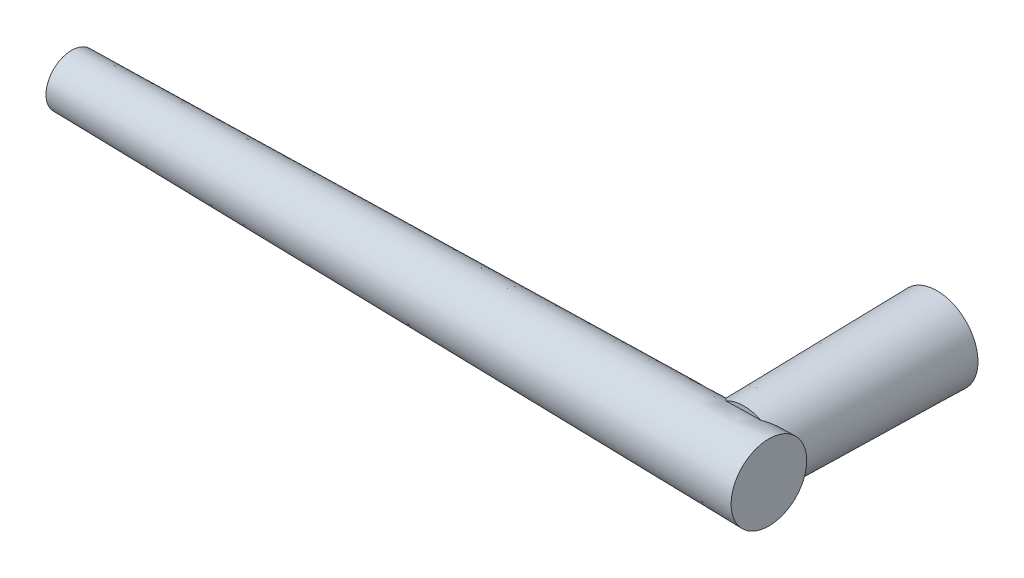
ISO-10303-21;
HEADER;
FILE_DESCRIPTION(('STEP AP214'),'2;1');
FILE_NAME('part.step','',(''),(''),'','','');
FILE_SCHEMA(('AUTOMOTIVE_DESIGN { 1 0 10303 214 1 1 1 1 }'));
ENDSEC;
DATA;
#1=APPLICATION_CONTEXT('core data for automotive mechanical design processes');
#2=APPLICATION_PROTOCOL_DEFINITION('international standard','automotive_design',2000,#1);
#3=PRODUCT_CONTEXT('',#1,'mechanical');
#4=PRODUCT('Part','Part','',(#3));
#5=PRODUCT_RELATED_PRODUCT_CATEGORY('part','',(#4));
#6=PRODUCT_DEFINITION_FORMATION('','',#4);
#7=PRODUCT_DEFINITION_CONTEXT('part definition',#1,'design');
#8=PRODUCT_DEFINITION('design','',#6,#7);
#9=PRODUCT_DEFINITION_SHAPE('','',#8);
#10=(LENGTH_UNIT() NAMED_UNIT(*) SI_UNIT(.MILLI.,.METRE.));
#11=(NAMED_UNIT(*) PLANE_ANGLE_UNIT() SI_UNIT($,.RADIAN.));
#12=(NAMED_UNIT(*) SI_UNIT($,.STERADIAN.) SOLID_ANGLE_UNIT());
#13=UNCERTAINTY_MEASURE_WITH_UNIT(LENGTH_MEASURE(1.E-05),#10,'distance_accuracy_value','');
#14=(GEOMETRIC_REPRESENTATION_CONTEXT(3) GLOBAL_UNCERTAINTY_ASSIGNED_CONTEXT((#13)) GLOBAL_UNIT_ASSIGNED_CONTEXT((#10,
#11,#12)) REPRESENTATION_CONTEXT('',''));
#15=CARTESIAN_POINT('',(0.,0.,0.));
#16=DIRECTION('',(0.,0.,1.));
#17=DIRECTION('',(1.,0.,0.));
#18=AXIS2_PLACEMENT_3D('',#15,#16,#17);
#19=CARTESIAN_POINT('',(0.,0.,24.));
#20=DIRECTION('',(0.,0.,1.));
#21=DIRECTION('',(1.,0.,0.));
#22=AXIS2_PLACEMENT_3D('',#19,#20,#21);
#23=PLANE('',#22);
#24=CARTESIAN_POINT('',(2.07741436600784,4.19485934561172,24.));
#25=CARTESIAN_POINT('',(1.35812225715702,4.18095033297915,24.));
#26=CARTESIAN_POINT('',(0.638830404039702,4.1670281203818,24.));
#27=CARTESIAN_POINT('',(-0.799752790731902,4.1391572952575,24.));
#28=CARTESIAN_POINT('',(-1.51904413238619,4.12520868273054,24.));
#29=CARTESIAN_POINT('',(-2.23833521830698,4.11124687023881,24.));
#30=B_SPLINE_CURVE_WITH_KNOTS('',3,(#24,#25,#26,#27,#28,#29),.UNSPECIFIED.,.F.,.F.,(4,2,4),(0.,
2.15827972739424,4.31655945480037),.UNSPECIFIED.);
#31=CARTESIAN_POINT('',(2.07741436600784,4.19485934561172,24.));
#32=VERTEX_POINT('',#31);
#33=CARTESIAN_POINT('',(-2.23833521830698,4.11124687023881,24.));
#34=VERTEX_POINT('',#33);
#35=EDGE_CURVE('E11',#32,#34,#30,.T.);
#36=ORIENTED_EDGE('',*,*,#35,.F.);
#37=CARTESIAN_POINT('',(0.,0.,24.));
#38=DIRECTION('',(0.,0.,1.));
#39=DIRECTION('',(1.,0.,0.));
#40=AXIS2_PLACEMENT_3D('',#37,#38,#39);
#41=CIRCLE('',#40,4.68107844172278);
#42=EDGE_CURVE('E71',#32,#34,#41,.T.);
#43=ORIENTED_EDGE('',*,*,#42,.T.);
#44=EDGE_LOOP('',(#36,#43));
#45=FACE_BOUND('',#44,.T.);
#46=ADVANCED_FACE('F44',(#45),#23,.T.);
#47=CARTESIAN_POINT('',(0.,0.,0.));
#48=DIRECTION('',(0.,0.,-1.));
#49=DIRECTION('',(1.,0.,0.));
#50=AXIS2_PLACEMENT_3D('',#47,#48,#49);
#51=CONICAL_SURFACE('',#50,5.1,0.0174532925199433);
#52=ORIENTED_EDGE('',*,*,#42,.F.);
#53=CARTESIAN_POINT('',(4.62946610201317,0.952113458118666,21.4058359474263));
#54=CARTESIAN_POINT('',(4.6678080599891,0.76897668688883,21.3672094470046));
#55=CARTESIAN_POINT('',(4.69552302533279,0.581192135724765,21.3392953739237));
#56=CARTESIAN_POINT('',(4.72762774543236,0.201578669276947,21.3069606365025));
#57=CARTESIAN_POINT('',(4.73201059822167,0.0097485741103849,21.302546923899));
#58=CARTESIAN_POINT('',(4.71711347778657,-0.371950091179068,21.3175501982362));
#59=CARTESIAN_POINT('',(4.69784389073633,-0.561819485368872,21.3369567253191));
#60=CARTESIAN_POINT('',(4.6370963629312,-0.934196859812772,21.3981477407934));
#61=CARTESIAN_POINT('',(4.59561230193108,-1.11670279647413,21.4399383961719));
#62=CARTESIAN_POINT('',(4.4930769533045,-1.47038792563278,21.5432630818858));
#63=CARTESIAN_POINT('',(4.43200138043407,-1.64155274049743,21.6048216161898));
#64=CARTESIAN_POINT('',(4.2935070488294,-1.96982975729361,21.7444722392737));
#65=CARTESIAN_POINT('',(4.21608226570798,-2.12693674870614,21.8225704226451));
#66=CARTESIAN_POINT('',(4.00470217024436,-2.50288652151101,22.0359160929234));
#67=CARTESIAN_POINT('',(3.86214693378467,-2.71194818847277,22.1799036396716));
#68=CARTESIAN_POINT('',(3.55540680863572,-3.09508103834212,22.490178389073));
#69=CARTESIAN_POINT('',(3.3911631238375,-3.26905373550321,22.6565262319859));
#70=CARTESIAN_POINT('',(3.10086225980611,-3.53479266938475,22.9512674676871));
#71=CARTESIAN_POINT('',(2.97858871880807,-3.63538887429749,23.0756070078275));
#72=CARTESIAN_POINT('',(2.72864232311084,-3.82110063577149,23.3304151093337));
#73=CARTESIAN_POINT('',(2.60096690789687,-3.9062087472442,23.4608865805869));
#74=CARTESIAN_POINT('',(2.34189691075265,-4.06146398657048,23.7266862668849));
#75=CARTESIAN_POINT('',(2.21050467628273,-4.1316203287765,23.8620114303045));
#76=CARTESIAN_POINT('',(1.94540763345244,-4.25758354455548,24.136865019039));
#77=CARTESIAN_POINT('',(1.81170392326487,-4.31339704269536,24.2763914705063));
#78=CARTESIAN_POINT('',(1.58509665108078,-4.39607302049441,24.515981185472));
#79=CARTESIAN_POINT('',(1.49232697088445,-4.42655553951389,24.6149444429456));
#80=CARTESIAN_POINT('',(1.30756772330938,-4.48095794886619,24.8151324162743));
#81=CARTESIAN_POINT('',(1.21557723598065,-4.50488708727526,24.9163537249959));
#82=CARTESIAN_POINT('',(1.06145810698191,-4.54005107568909,25.0913450208642));
#83=CARTESIAN_POINT('',(0.998672824445244,-4.5529390805094,25.164210588857));
#84=CARTESIAN_POINT('',(0.875586414717595,-4.57555679618949,25.3127833065261));
#85=CARTESIAN_POINT('',(0.815289665098719,-4.58528113268918,25.3884950503914));
#86=CARTESIAN_POINT('',(0.717804207239845,-4.5990186736765,25.5215604769697));
#87=CARTESIAN_POINT('',(0.679070433860697,-4.60387031389588,25.5776894977817));
#88=CARTESIAN_POINT('',(0.607560603155409,-4.61179973302761,25.6938441607893));
#89=CARTESIAN_POINT('',(0.574768933327155,-4.61488220794882,25.7538590123445));
#90=CARTESIAN_POINT('',(0.534163724401366,-4.61800919387459,25.8505719914854));
#91=CARTESIAN_POINT('',(0.521804404487346,-4.61879912374778,25.8852633787825));
#92=CARTESIAN_POINT('',(0.502649178172272,-4.61967926240967,25.9561023107735));
#93=CARTESIAN_POINT('',(0.495831904266769,-4.61977217010424,25.9922436935662));
#94=CARTESIAN_POINT('',(0.489149574977725,-4.61919806422445,26.0655914879562));
#95=CARTESIAN_POINT('',(0.489358507272479,-4.61852303570265,26.1028051079843));
#96=CARTESIAN_POINT('',(0.49686413887663,-4.61642689352539,26.1765084188647));
#97=CARTESIAN_POINT('',(0.50417564905945,-4.61500422367333,26.2129964343567));
#98=CARTESIAN_POINT('',(0.528645158504545,-4.61074792253514,26.2999306508923));
#99=CARTESIAN_POINT('',(0.548712222711613,-4.60756927010368,26.3494959013943));
#100=CARTESIAN_POINT('',(0.595254455912037,-4.60009884947222,26.4455202411158));
#101=CARTESIAN_POINT('',(0.62176561320425,-4.59580081990572,26.4919599470437));
#102=CARTESIAN_POINT('',(0.680086770021163,-4.58589757633368,26.5853385441603));
#103=CARTESIAN_POINT('',(0.712125287261216,-4.58022710241661,26.6321248011611));
#104=CARTESIAN_POINT('',(0.778491197054694,-4.56779177156933,26.7239105795353));
#105=CARTESIAN_POINT('',(0.812820319559154,-4.56102608186406,26.7689087085743));
#106=CARTESIAN_POINT('',(0.917956303870072,-4.53907966936218,26.9022514442598));
#107=CARTESIAN_POINT('',(0.990769002379476,-4.52227232914629,26.988737514321));
#108=CARTESIAN_POINT('',(1.13869413956969,-4.48425337565525,27.1592733342549));
#109=CARTESIAN_POINT('',(1.21381445612319,-4.46302480095466,27.2433122376052));
#110=CARTESIAN_POINT('',(1.36474146170138,-4.41617601365804,27.4093230516027));
#111=CARTESIAN_POINT('',(1.44054717849897,-4.3905613079415,27.4912974080623));
#112=CARTESIAN_POINT('',(1.66403152148498,-4.30845795984871,27.7306034123901));
#113=CARTESIAN_POINT('',(1.81178178637401,-4.24570535266786,27.8857733158175));
#114=CARTESIAN_POINT('',(2.1045802030477,-4.10248569750526,28.1907113836583));
#115=CARTESIAN_POINT('',(2.24962559345763,-4.02200151786776,28.3404741598918));
#116=CARTESIAN_POINT('',(2.53434113728088,-3.84281329275625,28.633088546966));
#117=CARTESIAN_POINT('',(2.67402692473397,-3.74416803207804,28.7759606309458));
#118=CARTESIAN_POINT('',(2.94618336659536,-3.52769750896196,29.053574530036));
#119=CARTESIAN_POINT('',(3.07866044261186,-3.40988970278872,29.1883235931683));
#120=CARTESIAN_POINT('',(3.35807103482136,-3.12999405161826,29.4720423343612));
#121=CARTESIAN_POINT('',(3.50303498791539,-2.96374536314097,29.6189176557283));
#122=CARTESIAN_POINT('',(3.77373683817567,-2.60190894306419,29.8928613170931));
#123=CARTESIAN_POINT('',(3.89950074600475,-2.40636162787106,30.0199564582927));
#124=CARTESIAN_POINT('',(4.10398144863477,-2.0252742916547,30.226453456498));
#125=CARTESIAN_POINT('',(4.18709778238668,-1.84458732423093,30.3103288616584));
#126=CARTESIAN_POINT('',(4.29530577509369,-1.5609683989115,30.4194842739293));
#127=CARTESIAN_POINT('',(4.32863841616665,-1.46429896013108,30.45310091493));
#128=CARTESIAN_POINT('',(4.38926289134984,-1.26722877854697,30.5142324159684));
#129=CARTESIAN_POINT('',(4.41655750906047,-1.16682978015167,30.5417500877145));
#130=CARTESIAN_POINT('',(4.4648006249627,-0.962013601409277,30.5903820450023));
#131=CARTESIAN_POINT('',(4.48569145967439,-0.857568933798585,30.6114381484979));
#132=CARTESIAN_POINT('',(4.52034094821415,-0.646364097751918,30.6463592721835));
#133=CARTESIAN_POINT('',(4.53410317669407,-0.539605117868623,30.6602278965491));
#134=CARTESIAN_POINT('',(4.55418386711464,-0.324716701355868,30.6804631890058));
#135=CARTESIAN_POINT('',(4.56050486337722,-0.216587743999867,30.6868324112305));
#136=CARTESIAN_POINT('',(4.56555568978142,1.92788652367574E-05,30.6919218058731));
#137=CARTESIAN_POINT('',(4.56428643041361,0.108497300942014,30.6906428957243));
#138=CARTESIAN_POINT('',(4.55485893768673,0.310425324064716,30.6811432941832));
#139=CARTESIAN_POINT('',(4.5476341073015,0.403965234849037,30.6738631593645));
#140=CARTESIAN_POINT('',(4.52763584615465,0.589850398136089,30.6537104739778));
#141=CARTESIAN_POINT('',(4.5148607212748,0.682195277009455,30.6408362159137));
#142=CARTESIAN_POINT('',(4.4685187525123,0.956427732918366,30.5941304829373));
#143=CARTESIAN_POINT('',(4.42692658104184,1.13568831016065,30.5522072556732));
#144=CARTESIAN_POINT('',(4.32395315867046,1.48625026522663,30.4483792733709));
#145=CARTESIAN_POINT('',(4.26219909743382,1.65732601617446,30.3860980540707));
#146=CARTESIAN_POINT('',(4.12238877539036,1.98533732899837,30.245024176189));
#147=CARTESIAN_POINT('',(4.04432581060353,2.14226703787352,30.1662247275365));
#148=CARTESIAN_POINT('',(3.83114349740415,2.51812958785604,29.9508847549696));
#149=CARTESIAN_POINT('',(3.68739726068953,2.72714751427817,29.8055602303704));
#150=CARTESIAN_POINT('',(3.37832862680326,3.10995606039109,29.4925688391781));
#151=CARTESIAN_POINT('',(3.21294430680877,3.28364177740803,29.3248378206369));
#152=CARTESIAN_POINT('',(2.92074352808415,3.54878933804904,29.0276253132003));
#153=CARTESIAN_POINT('',(2.79766799271133,3.64912655048306,28.9022034804409));
#154=CARTESIAN_POINT('',(2.54621450576746,3.83420600090175,28.6451705417758));
#155=CARTESIAN_POINT('',(2.41783396949218,3.91894052458251,28.5135564144257));
#156=CARTESIAN_POINT('',(2.15763530659765,4.07328648346753,28.2454589259809));
#157=CARTESIAN_POINT('',(2.02582230204706,4.14291915144069,28.1089827195199));
#158=CARTESIAN_POINT('',(1.76023105644971,4.26777322418196,27.8315778720595));
#159=CARTESIAN_POINT('',(1.62645384739532,4.32300192941567,27.6906515273204));
#160=CARTESIAN_POINT('',(1.40998934256976,4.40121328160036,27.4583583430792));
#161=CARTESIAN_POINT('',(1.32719989740853,4.42847544603909,27.3685024992988));
#162=CARTESIAN_POINT('',(1.16270965107926,4.4777637326168,27.1862791133881));
#163=CARTESIAN_POINT('',(1.08100954402288,4.49978665402367,27.0939100741062));
#164=CARTESIAN_POINT('',(0.930573318916356,4.53625775352945,26.916907637166));
#165=CARTESIAN_POINT('',(0.86147632213693,4.55130372493026,26.8327152634962));
#166=CARTESIAN_POINT('',(0.762617674535796,4.570849533001,26.7023622119883));
#167=CARTESIAN_POINT('',(0.730473437710674,4.57685930495044,26.6582505861378));
#168=CARTESIAN_POINT('',(0.668934137257574,4.58784633406832,26.5680477985068));
#169=CARTESIAN_POINT('',(0.639535886071582,4.59282479677617,26.5219590248751));
#170=CARTESIAN_POINT('',(0.591221310860685,4.60076220639854,26.4368242250894));
#171=CARTESIAN_POINT('',(0.571398903531064,4.60392575076102,26.3983228024239));
#172=CARTESIAN_POINT('',(0.536746360949371,4.60948645366166,26.3190901517644));
#173=CARTESIAN_POINT('',(0.52190183505638,4.6118858203459,26.2783657541314));
#174=CARTESIAN_POINT('',(0.502351212858753,4.61535848885027,26.2039538922334));
#175=CARTESIAN_POINT('',(0.496133046870064,4.61660740235504,26.170689635743));
#176=CARTESIAN_POINT('',(0.489586350292935,4.61848463166816,26.1035894779944));
#177=CARTESIAN_POINT('',(0.48924749044183,4.61911403404995,26.0697546838478));
#178=CARTESIAN_POINT('',(0.494500133860496,4.61973201915815,26.0026435826592));
#179=CARTESIAN_POINT('',(0.500079390426302,4.61972192270304,25.9693662664828));
#180=CARTESIAN_POINT('',(0.516119128974688,4.61910631095707,25.9039933099309));
#181=CARTESIAN_POINT('',(0.526591059151607,4.61849939549121,25.871900632507));
#182=CARTESIAN_POINT('',(0.570922319588994,4.61532863437872,25.7574691994962));
#183=CARTESIAN_POINT('',(0.614917385467675,4.61118796424949,25.679315395098));
#184=CARTESIAN_POINT('',(0.711672256209942,4.5999361806505,25.5286454980314));
#185=CARTESIAN_POINT('',(0.764517098144638,4.59279512094984,25.4561952379359));
#186=CARTESIAN_POINT('',(0.879717852084809,4.57484607501356,25.3072424185709));
#187=CARTESIAN_POINT('',(0.942492552644092,4.56373580465595,25.2310928339509));
#188=CARTESIAN_POINT('',(1.0701532417807,4.5381953149034,25.0811422678706));
#189=CARTESIAN_POINT('',(1.13504077678651,4.52376261462391,25.0073430885886));
#190=CARTESIAN_POINT('',(1.33130343279941,4.47544884533415,24.788060672465));
#191=CARTESIAN_POINT('',(1.46409866378313,4.43657892107996,24.6449083669133));
#192=CARTESIAN_POINT('',(1.72922470852074,4.34542155925793,24.363077563399));
#193=CARTESIAN_POINT('',(1.86155592660847,4.29315924172385,24.2243912309816));
#194=CARTESIAN_POINT('',(2.12416656534823,4.17481629381031,23.9512253411121));
#195=CARTESIAN_POINT('',(2.25444755828534,4.108746869004,23.816742473337));
#196=CARTESIAN_POINT('',(2.51244818936161,3.96177209088376,23.5515389733231));
#197=CARTESIAN_POINT('',(2.64014578266804,3.8807734516861,23.4208483371798));
#198=CARTESIAN_POINT('',(2.89071944851275,3.70357140282587,23.1650816189371));
#199=CARTESIAN_POINT('',(3.01359341716793,3.60736144855056,23.0400079834107));
#200=CARTESIAN_POINT('',(3.2525682763327,3.39931440149106,22.7971761812419));
#201=CARTESIAN_POINT('',(3.3686828631506,3.28751058769629,22.679403187717));
#202=CARTESIAN_POINT('',(3.59233777721793,3.04762680808485,22.452821145502));
#203=CARTESIAN_POINT('',(3.69988530167942,2.91956074398512,22.3440045698896));
#204=CARTESIAN_POINT('',(3.92248338810661,2.62212248299244,22.1189630589437));
#205=CARTESIAN_POINT('',(4.03541082125311,2.44946286637023,22.004919219646));
#206=CARTESIAN_POINT('',(4.24092972403736,2.08148101861938,21.7974947210693));
#207=CARTESIAN_POINT('',(4.33357746495048,1.88622385545218,21.7040568795437));
#208=CARTESIAN_POINT('',(4.4581707968922,1.56529184867307,21.5784471113789));
#209=CARTESIAN_POINT('',(4.49895645850132,1.44646727117075,21.5373395955868));
#210=CARTESIAN_POINT('',(4.57134749244944,1.20320913693643,21.4643890080237));
#211=CARTESIAN_POINT('',(4.60294837990089,1.07877287418349,21.4325504622404));
#212=CARTESIAN_POINT('',(4.62946610201317,0.952113458118666,21.4058359474263));
#213=B_SPLINE_CURVE_WITH_KNOTS('',3,(#53,#54,#55,#56,#57,#58,#59,#60,#61,#62,#63,#64,#65,#66,
#67,#68,#69,#70,#71,#72,#73,#74,#75,#76,#77,#78,#79,#80,#81,#82,#83,#84,#85,#86,#87,#88,#89,#90,
#91,#92,#93,#94,#95,#96,#97,#98,#99,#100,#101,#102,#103,#104,#105,#106,#107,#108,#109,#110,#111,
#112,#113,#114,#115,#116,#117,#118,#119,#120,#121,#122,#123,#124,#125,#126,#127,#128,#129,#130,
#131,#132,#133,#134,#135,#136,#137,#138,#139,#140,#141,#142,#143,#144,#145,#146,#147,#148,#149,
#150,#151,#152,#153,#154,#155,#156,#157,#158,#159,#160,#161,#162,#163,#164,#165,#166,#167,#168,
#169,#170,#171,#172,#173,#174,#175,#176,#177,#178,#179,#180,#181,#182,#183,#184,#185,#186,#187,
#188,#189,#190,#191,#192,#193,#194,#195,#196,#197,#198,#199,#200,#201,#202,#203,#204,#205,#206,
#207,#208,#209,#210,#211,#212),.UNSPECIFIED.,.T.,.F.,(4,2,2,2,2,2,2,2,2,2,2,2,2,2,2,2,2,2,2,2,2,
2,2,2,2,2,2,2,2,2,2,2,2,2,2,2,2,2,2,2,2,2,2,2,2,2,2,2,2,2,2,2,2,2,2,2,2,2,2,2,2,2,2,2,2,2,2,2,2,
2,2,2,2,2,2,2,2,2,2,4),(0.,0.572683358334292,1.14553611503854,1.71813741266986,2.29089654724739,
2.86436842407239,3.43805198477544,4.30664495513804,5.17764291874493,5.78086833342271,
6.38438295551835,6.98752456619521,7.59038709954839,8.00732664311387,8.42367473716692,
8.71474540005509,9.00630797544235,9.21129236568192,9.41573010594997,9.52591353209948,
9.63567010105351,9.74658279200901,9.85772726471241,10.0175198417189,10.1782261866174,
10.349049932342,10.5200041836753,10.8626676283535,11.2066707002499,11.5502449940898,
12.2192261010179,12.8888564121204,13.5563561643936,14.2232512235611,15.0156187792912,
15.8069031880588,16.4516503533009,16.774222719174,17.0966460640078,17.421892748277,
17.7469761787612,18.0719488608354,18.3968825615319,18.678837630489,18.9608788212136,
19.5244409885735,20.0990776056866,20.6739509008178,21.5461766844774,22.4209555118111,
23.0272612962343,23.6338660510149,24.2396123273492,24.8450509896017,25.2204877507531,
25.5961532862255,25.9257361214702,26.0904076219654,26.2548855312893,26.3849427376733,
26.5146206511968,26.6157661794182,26.716733988585,26.8174932660336,26.9184894964302,
27.1856175216218,27.4554775193592,27.7531761557649,28.0510978113098,28.6477857278871,
29.2433625297205,29.8384578374917,30.4374060999962,31.0366127625962,31.6345596816213,
32.231998846552,32.9367688693418,33.6395578121085,34.0354389716965,34.4315131149151),.UNSPECIFIED.);
#214=CARTESIAN_POINT('',(2.07741436600782,-4.19485934561172,24.));
#215=VERTEX_POINT('',#214);
#216=EDGE_CURVE('E76',#32,#215,#213,.T.);
#217=ORIENTED_EDGE('',*,*,#216,.T.);
#218=CARTESIAN_POINT('',(-2.23833521830698,-4.11124687023881,24.));
#219=VERTEX_POINT('',#218);
#220=EDGE_CURVE('E66',#219,#215,#41,.T.);
#221=ORIENTED_EDGE('',*,*,#220,.F.);
#222=CARTESIAN_POINT('',(-2.23833521830698,-4.11124687023881,24.));
#223=CARTESIAN_POINT('',(-2.3617731022619,-4.0465693901944,23.8720646743482));
#224=CARTESIAN_POINT('',(-2.48400096604271,-3.97545521848548,23.7460859147195));
#225=CARTESIAN_POINT('',(-2.72500773031594,-3.81962214400791,23.4986469819444));
#226=CARTESIAN_POINT('',(-2.84377741760991,-3.73487023971258,23.3771986730332));
#227=CARTESIAN_POINT('',(-3.07759141325432,-3.55025936050502,23.1386639005852));
#228=CARTESIAN_POINT('',(-3.19257517878024,-3.45023383095424,23.0216458680628));
#229=CARTESIAN_POINT('',(-3.41555948555934,-3.23538936803271,22.7950830494286));
#230=CARTESIAN_POINT('',(-3.52356750750475,-3.12058669077661,22.6855302505141));
#231=CARTESIAN_POINT('',(-3.76093119682562,-2.83999715567223,22.4450346627878));
#232=CARTESIAN_POINT('',(-3.88739204893288,-2.66908060599398,22.3171043696926));
#233=CARTESIAN_POINT('',(-4.12000301268291,-2.30208173141402,22.0819944678835));
#234=CARTESIAN_POINT('',(-4.22623580094993,-2.10610756823802,21.9747303695365));
#235=CARTESIAN_POINT('',(-4.39686056096801,-1.72524648958366,21.8025388108896));
#236=CARTESIAN_POINT('',(-4.46528816014887,-1.54407050686152,21.733521418128));
#237=CARTESIAN_POINT('',(-4.55141157193313,-1.26218510821458,21.6466787971458));
#238=CARTESIAN_POINT('',(-4.5773761037463,-1.1664809909452,21.6205020380284));
#239=CARTESIAN_POINT('',(-4.62335256793368,-0.972247358811016,21.5741547900709));
#240=CARTESIAN_POINT('',(-4.64336708874042,-0.873719093048614,21.5539816894559));
#241=CARTESIAN_POINT('',(-4.67716825872375,-0.673864461319194,21.5199151046793));
#242=CARTESIAN_POINT('',(-4.69091453851042,-0.572524296654869,21.506062325009));
#243=CARTESIAN_POINT('',(-4.71169899398955,-0.368505682222948,21.4851175842517));
#244=CARTESIAN_POINT('',(-4.71874015426645,-0.265827848529509,21.4780226151262));
#245=CARTESIAN_POINT('',(-4.72596792097283,-0.059996629222025,21.4707396202695));
#246=CARTESIAN_POINT('',(-4.72615525573841,0.0431567046968396,21.4705508606357));
#247=CARTESIAN_POINT('',(-4.71967328335082,0.24902116009359,21.4770823503581));
#248=CARTESIAN_POINT('',(-4.71300444826792,0.351732311528281,21.4838021240387));
#249=CARTESIAN_POINT('',(-4.6939590532473,0.545634379842977,21.5029942856151));
#250=CARTESIAN_POINT('',(-4.68221824573661,0.636952392038316,21.5148259361247));
#251=CARTESIAN_POINT('',(-4.65350725127896,0.817926514935439,21.5437616328736));
#252=CARTESIAN_POINT('',(-4.63653534991413,0.907582070562586,21.560867407634));
#253=CARTESIAN_POINT('',(-4.57816674016531,1.1731884234332,21.619703127203));
#254=CARTESIAN_POINT('',(-4.52930261643474,1.34592086763874,21.6689660812005));
#255=CARTESIAN_POINT('',(-4.41104195998795,1.68910232660288,21.7882376818588));
#256=CARTESIAN_POINT('',(-4.34060311254094,1.85881380342046,21.859299849901));
#257=CARTESIAN_POINT('',(-4.1840239907647,2.18266408052091,22.0173574574986));
#258=CARTESIAN_POINT('',(-4.09788177860401,2.3368009552092,22.1043548635054));
#259=CARTESIAN_POINT('',(-3.86119742332637,2.7106894731083,22.3435780518544));
#260=CARTESIAN_POINT('',(-3.70159562541335,2.91888107306565,22.5050592694561));
#261=CARTESIAN_POINT('',(-3.44648393338205,3.20203838853254,22.7637317425361));
#262=CARTESIAN_POINT('',(-3.35853895404982,3.29179566971766,22.8529923639409));
#263=CARTESIAN_POINT('',(-3.1783233849847,3.46177117272402,23.0361653290456));
#264=CARTESIAN_POINT('',(-3.08605308224544,3.541990026193,23.1300773641385));
#265=CARTESIAN_POINT('',(-2.86232252269537,3.72187192625852,23.3582302493365));
#266=CARTESIAN_POINT('',(-2.729293561629,3.81734063818,23.494235505946));
#267=CARTESIAN_POINT('',(-2.45846023224602,3.99144100657824,23.7723196205845));
#268=CARTESIAN_POINT('',(-2.32065248802426,4.07006046653808,23.9144027895313));
#269=CARTESIAN_POINT('',(-2.11278109634596,4.17531708018517,24.1303968357361));
#270=CARTESIAN_POINT('',(-2.04376407477099,4.20811194076513,24.2023808419339));
#271=CARTESIAN_POINT('',(-1.90529597233216,4.26981512055877,24.3475959154438));
#272=CARTESIAN_POINT('',(-1.83584488904907,4.29872341809048,24.4208269897103));
#273=CARTESIAN_POINT('',(-1.69692308763987,4.35266387095932,24.5684459253333));
#274=CARTESIAN_POINT('',(-1.62745257944059,4.37770216531384,24.6428317442419));
#275=CARTESIAN_POINT('',(-1.48887884680305,4.42398946425386,24.7931035253484));
#276=CARTESIAN_POINT('',(-1.41977561028656,4.4452385942086,24.8689894378215));
#277=CARTESIAN_POINT('',(-1.35110265157923,4.46460962272189,24.9457423635149));
#278=B_SPLINE_CURVE_WITH_KNOTS('',3,(#222,#223,#224,#225,#226,#227,#228,#229,#230,#231,#232,
#233,#234,#235,#236,#237,#238,#239,#240,#241,#242,#243,#244,#245,#246,#247,#248,#249,#250,#251,
#252,#253,#254,#255,#256,#257,#258,#259,#260,#261,#262,#263,#264,#265,#266,#267,#268,#269,#270,
#271,#272,#273,#274,#275,#276,#277),.UNSPECIFIED.,.F.,.F.,(4,2,2,2,2,2,2,2,2,2,2,2,2,2,2,2,2,2,
2,2,2,2,2,2,2,2,2,4),(0.,0.567533565101444,1.13646173177722,1.71210724703877,2.28712483072718,
3.0289275546484,3.76763003234618,4.38165989329362,4.68901301825226,4.99623223909908,
5.30540303043838,5.61443613918415,5.92343640778586,6.23241540210906,6.5105714788279,
6.78881881442106,7.34488819751737,7.93380328813361,8.52279110148711,9.44143033398664,
9.90354949023063,10.3656380272481,11.0033149289988,11.6414518727112,11.9563235979126,
12.2711970796157,12.5855658320707,12.8999241813121),.UNSPECIFIED.);
#279=EDGE_CURVE('E84',#219,#34,#278,.T.);
#280=ORIENTED_EDGE('',*,*,#279,.T.);
#281=EDGE_LOOP('',(#52,#217,#221,#280));
#282=FACE_BOUND('',#281,.T.);
#283=CARTESIAN_POINT('',(0.,0.,0.));
#284=DIRECTION('',(0.,0.,1.));
#285=DIRECTION('',(1.,0.,0.));
#286=AXIS2_PLACEMENT_3D('',#283,#284,#285);
#287=CIRCLE('',#286,5.1);
#288=CARTESIAN_POINT('',(5.1,0.,0.));
#289=VERTEX_POINT('',#288);
#290=EDGE_CURVE('E83',#289,#289,#287,.T.);
#291=ORIENTED_EDGE('',*,*,#290,.T.);
#292=EDGE_LOOP('',(#291));
#293=FACE_BOUND('',#292,.T.);
#294=ADVANCED_FACE('F77',(#282,#293),#51,.T.);
#295=CARTESIAN_POINT('',(-25.1568874840973,-3.66120878565537,24.));
#296=CARTESIAN_POINT('',(-22.8873754599877,-3.70634764370025,24.));
#297=CARTESIAN_POINT('',(-20.6178596651008,-3.75129661888552,24.));
#298=CARTESIAN_POINT('',(-16.0788213188562,-3.84084998614164,24.));
#299=CARTESIAN_POINT('',(-13.8092987674986,-3.88545437821901,24.));
#300=CARTESIAN_POINT('',(-9.27024761441755,-3.97435376343438,24.));
#301=CARTESIAN_POINT('',(-7.00071901269406,-4.01864875657332,24.));
#302=CARTESIAN_POINT('',(-2.46165629843419,-4.10695772233358,24.));
#303=CARTESIAN_POINT('',(-0.192122185897713,-4.15097169494959,24.));
#304=CARTESIAN_POINT('',(2.07741436600782,-4.19485934561177,24.));
#305=B_SPLINE_CURVE_WITH_KNOTS('',3,(#295,#296,#297,#298,#299,#300,#301,#302,#303,#304),
.UNSPECIFIED.,.F.,.F.,(4,2,2,2,4),(0.,6.80988258884898,13.6197650490122,20.429647488788,
27.2395300571793),.UNSPECIFIED.);
#306=EDGE_CURVE('E57',#219,#215,#305,.T.);
#307=ORIENTED_EDGE('',*,*,#306,.F.);
#308=ORIENTED_EDGE('',*,*,#220,.T.);
#309=EDGE_LOOP('',(#307,#308));
#310=FACE_BOUND('',#309,.T.);
#311=ADVANCED_FACE('F105',(#310),#23,.T.);
#312=CARTESIAN_POINT('',(0.,0.,0.));
#313=DIRECTION('',(0.,0.,1.));
#314=DIRECTION('',(1.,0.,0.));
#315=AXIS2_PLACEMENT_3D('',#312,#313,#314);
#316=PLANE('',#315);
#317=ORIENTED_EDGE('',*,*,#290,.F.);
#318=EDGE_LOOP('',(#317));
#319=FACE_BOUND('',#318,.T.);
#320=ADVANCED_FACE('F103',(#319),#316,.F.);
#321=CARTESIAN_POINT('',(5.1,0.,0.));
#322=DIRECTION('',(-1.,0.,0.));
#323=DIRECTION('',(0.,0.,1.));
#324=AXIS2_PLACEMENT_3D('',#321,#322,#323);
#325=PLANE('',#324);
#326=CARTESIAN_POINT('',(5.09999999999999,0.,26.));
#327=DIRECTION('',(-1.,0.,0.));
#328=DIRECTION('',(0.,0.,1.));
#329=AXIS2_PLACEMENT_3D('',#326,#327,#328);
#330=CIRCLE('',#329,4.7);
#331=CARTESIAN_POINT('',(5.09999999999999,0.,30.7));
#332=VERTEX_POINT('',#331);
#333=EDGE_CURVE('E86',#332,#332,#330,.T.);
#334=ORIENTED_EDGE('',*,*,#333,.F.);
#335=EDGE_LOOP('',(#334));
#336=FACE_BOUND('',#335,.T.);
#337=ADVANCED_FACE('F118',(#336),#325,.F.);
#338=CARTESIAN_POINT('',(5.09999999999999,0.,26.));
#339=DIRECTION('',(1.,0.,0.));
#340=DIRECTION('',(0.,0.,1.));
#341=AXIS2_PLACEMENT_3D('',#338,#339,#340);
#342=CONICAL_SURFACE('',#341,4.7,0.0174532925199433);
#343=ORIENTED_EDGE('',*,*,#216,.F.);
#344=ORIENTED_EDGE('',*,*,#35,.T.);
#345=ORIENTED_EDGE('',*,*,#279,.F.);
#346=ORIENTED_EDGE('',*,*,#306,.T.);
#347=EDGE_LOOP('',(#343,#344,#345,#346));
#348=FACE_BOUND('',#347,.T.);
#349=ORIENTED_EDGE('',*,*,#333,.T.);
#350=EDGE_LOOP('',(#349));
#351=FACE_BOUND('',#350,.T.);
#352=CARTESIAN_POINT('',(-81.6,0.,26.));
#353=DIRECTION('',(-1.,0.,0.));
#354=DIRECTION('',(0.,0.,1.));
#355=AXIS2_PLACEMENT_3D('',#352,#353,#354);
#356=CIRCLE('',#355,3.18664587072353);
#357=CARTESIAN_POINT('',(-81.6,0.,29.1866458707235));
#358=VERTEX_POINT('',#357);
#359=EDGE_CURVE('E49',#358,#358,#356,.T.);
#360=ORIENTED_EDGE('',*,*,#359,.F.);
#361=EDGE_LOOP('',(#360));
#362=FACE_BOUND('',#361,.T.);
#363=ADVANCED_FACE('F50',(#348,#351,#362),#342,.T.);
#364=CARTESIAN_POINT('',(-81.6,0.,0.));
#365=DIRECTION('',(-1.,0.,0.));
#366=DIRECTION('',(0.,0.,1.));
#367=AXIS2_PLACEMENT_3D('',#364,#365,#366);
#368=PLANE('',#367);
#369=ORIENTED_EDGE('',*,*,#359,.T.);
#370=EDGE_LOOP('',(#369));
#371=FACE_BOUND('',#370,.T.);
#372=ADVANCED_FACE('F124',(#371),#368,.T.);
#373=CLOSED_SHELL('',(#46,#294,#311,#320,#337,#363,#372));
#374=MANIFOLD_SOLID_BREP('B2',#373);
#375=ADVANCED_BREP_SHAPE_REPRESENTATION('',(#18,#374),#14);
#376=SHAPE_DEFINITION_REPRESENTATION(#9,#375);
ENDSEC;
END-ISO-10303-21;
